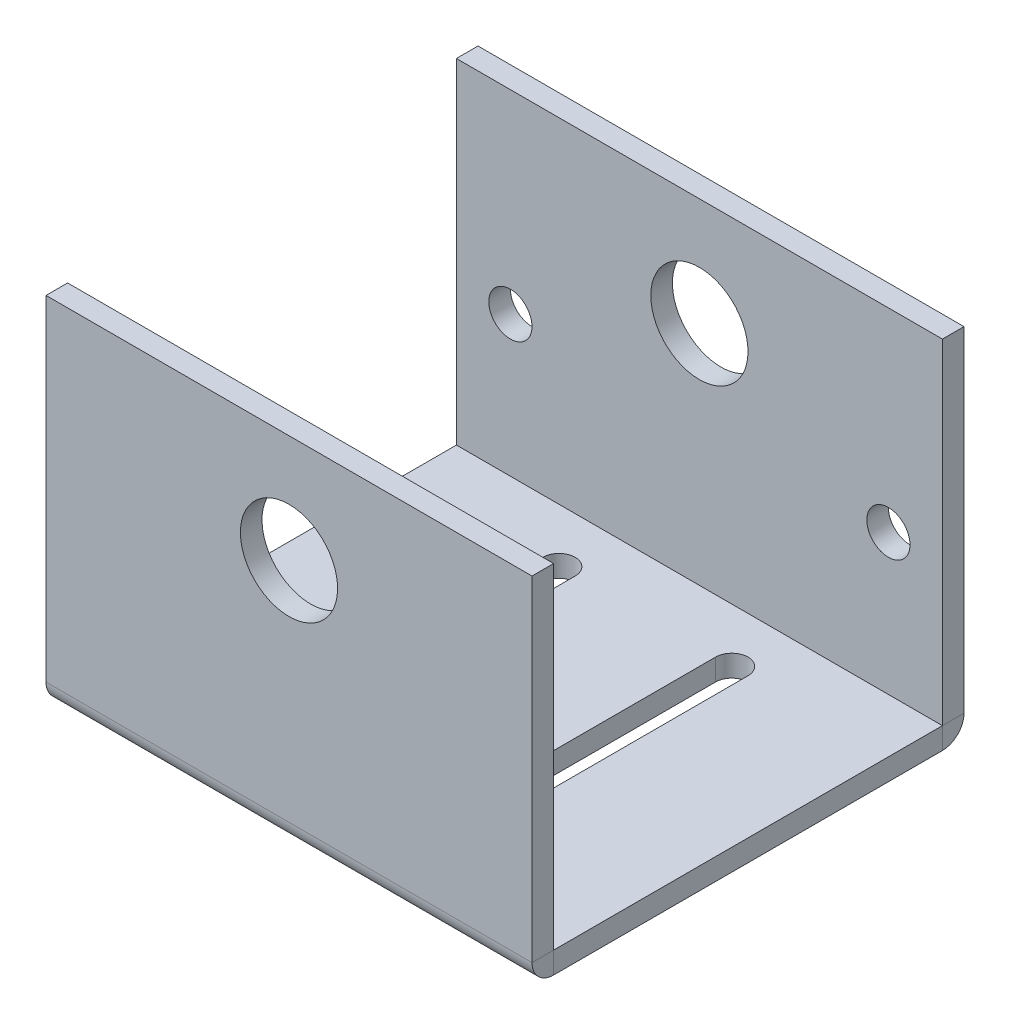
ISO-10303-21;
HEADER;
FILE_DESCRIPTION(('STEP AP214'),'2;1');
FILE_NAME('part.step','',(''),(''),'','','');
FILE_SCHEMA(('AUTOMOTIVE_DESIGN { 1 0 10303 214 1 1 1 1 }'));
ENDSEC;
DATA;
#1=APPLICATION_CONTEXT('core data for automotive mechanical design processes');
#2=APPLICATION_PROTOCOL_DEFINITION('international standard','automotive_design',2000,#1);
#3=PRODUCT_CONTEXT('',#1,'mechanical');
#4=PRODUCT('Part','Part','',(#3));
#5=PRODUCT_RELATED_PRODUCT_CATEGORY('part','',(#4));
#6=PRODUCT_DEFINITION_FORMATION('','',#4);
#7=PRODUCT_DEFINITION_CONTEXT('part definition',#1,'design');
#8=PRODUCT_DEFINITION('design','',#6,#7);
#9=PRODUCT_DEFINITION_SHAPE('','',#8);
#10=(LENGTH_UNIT() NAMED_UNIT(*) SI_UNIT(.MILLI.,.METRE.));
#11=(NAMED_UNIT(*) PLANE_ANGLE_UNIT() SI_UNIT($,.RADIAN.));
#12=(NAMED_UNIT(*) SI_UNIT($,.STERADIAN.) SOLID_ANGLE_UNIT());
#13=UNCERTAINTY_MEASURE_WITH_UNIT(LENGTH_MEASURE(1.E-05),#10,'distance_accuracy_value','');
#14=(GEOMETRIC_REPRESENTATION_CONTEXT(3) GLOBAL_UNCERTAINTY_ASSIGNED_CONTEXT((#13)) GLOBAL_UNIT_ASSIGNED_CONTEXT((#10,
#11,#12)) REPRESENTATION_CONTEXT('',''));
#15=CARTESIAN_POINT('',(0.,0.,0.));
#16=DIRECTION('',(0.,0.,1.));
#17=DIRECTION('',(1.,0.,0.));
#18=AXIS2_PLACEMENT_3D('',#15,#16,#17);
#19=CARTESIAN_POINT('',(0.,-2.,0.));
#20=DIRECTION('',(0.,1.,0.));
#21=DIRECTION('',(0.,0.,1.));
#22=AXIS2_PLACEMENT_3D('',#19,#20,#21);
#23=PLANE('',#22);
#24=DIRECTION('',(-1.,0.,0.));
#25=VECTOR('',#24,1.);
#26=CARTESIAN_POINT('',(0.,-2.,18.));
#27=LINE('',#26,#25);
#28=CARTESIAN_POINT('',(-22.5,-2.00000000000001,18.));
#29=VERTEX_POINT('',#28);
#30=CARTESIAN_POINT('',(22.5,-1.99999999999999,18.));
#31=VERTEX_POINT('',#30);
#32=EDGE_CURVE('E299',#29,#31,#27,.F.);
#33=ORIENTED_EDGE('',*,*,#32,.F.);
#34=DIRECTION('',(0.,0.,1.));
#35=VECTOR('',#34,1.);
#36=CARTESIAN_POINT('',(-22.5,-2.00000000000001,-20.));
#37=LINE('',#36,#35);
#38=CARTESIAN_POINT('',(-22.5,-2.00000000000001,-18.));
#39=VERTEX_POINT('',#38);
#40=EDGE_CURVE('E13',#39,#29,#37,.T.);
#41=ORIENTED_EDGE('',*,*,#40,.F.);
#42=DIRECTION('',(-1.,0.,0.));
#43=VECTOR('',#42,1.);
#44=CARTESIAN_POINT('',(0.,-2.,-18.));
#45=LINE('',#44,#43);
#46=CARTESIAN_POINT('',(22.5,-2.,-18.));
#47=VERTEX_POINT('',#46);
#48=EDGE_CURVE('E342',#47,#39,#45,.T.);
#49=ORIENTED_EDGE('',*,*,#48,.F.);
#50=DIRECTION('',(0.,0.,-1.));
#51=VECTOR('',#50,1.);
#52=CARTESIAN_POINT('',(22.5,-1.99999999999999,-20.));
#53=LINE('',#52,#51);
#54=EDGE_CURVE('E85',#31,#47,#53,.T.);
#55=ORIENTED_EDGE('',*,*,#54,.F.);
#56=EDGE_LOOP('',(#33,#41,#49,#55));
#57=FACE_BOUND('',#56,.T.);
#58=DIRECTION('',(0.,0.,-1.));
#59=VECTOR('',#58,1.);
#60=CARTESIAN_POINT('',(-9.49999999999999,-2.,13.));
#61=LINE('',#60,#59);
#62=CARTESIAN_POINT('',(-9.49999999999999,-2.,13.));
#63=VERTEX_POINT('',#62);
#64=CARTESIAN_POINT('',(-9.49999999999999,-2.,-13.));
#65=VERTEX_POINT('',#64);
#66=EDGE_CURVE('E236',#63,#65,#61,.T.);
#67=ORIENTED_EDGE('',*,*,#66,.F.);
#68=CARTESIAN_POINT('',(-7.99999999999999,-2.,13.));
#69=DIRECTION('',(0.,1.,0.));
#70=DIRECTION('',(0.,0.,1.));
#71=AXIS2_PLACEMENT_3D('',#68,#69,#70);
#72=CIRCLE('',#71,1.5);
#73=CARTESIAN_POINT('',(-6.49999999999999,-2.,13.));
#74=VERTEX_POINT('',#73);
#75=EDGE_CURVE('E239',#74,#63,#72,.F.);
#76=ORIENTED_EDGE('',*,*,#75,.F.);
#77=DIRECTION('',(0.,0.,1.));
#78=VECTOR('',#77,1.);
#79=CARTESIAN_POINT('',(-6.49999999999999,-2.,13.));
#80=LINE('',#79,#78);
#81=CARTESIAN_POINT('',(-6.49999999999999,-2.,-13.));
#82=VERTEX_POINT('',#81);
#83=EDGE_CURVE('E256',#82,#74,#80,.T.);
#84=ORIENTED_EDGE('',*,*,#83,.F.);
#85=CARTESIAN_POINT('',(-7.99999999999999,-2.,-13.));
#86=DIRECTION('',(0.,1.,0.));
#87=DIRECTION('',(0.,0.,1.));
#88=AXIS2_PLACEMENT_3D('',#85,#86,#87);
#89=CIRCLE('',#88,1.5);
#90=EDGE_CURVE('E208',#65,#82,#89,.F.);
#91=ORIENTED_EDGE('',*,*,#90,.F.);
#92=EDGE_LOOP('',(#67,#76,#84,#91));
#93=FACE_BOUND('',#92,.T.);
#94=CARTESIAN_POINT('',(7.99999999999999,-2.,13.));
#95=DIRECTION('',(0.,1.,0.));
#96=DIRECTION('',(0.,0.,1.));
#97=AXIS2_PLACEMENT_3D('',#94,#95,#96);
#98=CIRCLE('',#97,1.5);
#99=CARTESIAN_POINT('',(6.49999999999999,-2.,13.));
#100=VERTEX_POINT('',#99);
#101=CARTESIAN_POINT('',(9.49999999999999,-2.,13.));
#102=VERTEX_POINT('',#101);
#103=EDGE_CURVE('E212',#100,#102,#98,.T.);
#104=ORIENTED_EDGE('',*,*,#103,.T.);
#105=DIRECTION('',(0.,0.,-1.));
#106=VECTOR('',#105,1.);
#107=CARTESIAN_POINT('',(9.49999999999999,-2.,13.));
#108=LINE('',#107,#106);
#109=CARTESIAN_POINT('',(9.49999999999999,-2.,-13.));
#110=VERTEX_POINT('',#109);
#111=EDGE_CURVE('E201',#102,#110,#108,.T.);
#112=ORIENTED_EDGE('',*,*,#111,.T.);
#113=CARTESIAN_POINT('',(7.99999999999999,-2.,-13.));
#114=DIRECTION('',(0.,1.,0.));
#115=DIRECTION('',(0.,0.,1.));
#116=AXIS2_PLACEMENT_3D('',#113,#114,#115);
#117=CIRCLE('',#116,1.5);
#118=CARTESIAN_POINT('',(6.49999999999999,-2.,-13.));
#119=VERTEX_POINT('',#118);
#120=EDGE_CURVE('E221',#110,#119,#117,.T.);
#121=ORIENTED_EDGE('',*,*,#120,.T.);
#122=DIRECTION('',(0.,0.,1.));
#123=VECTOR('',#122,1.);
#124=CARTESIAN_POINT('',(6.49999999999999,-2.,13.));
#125=LINE('',#124,#123);
#126=EDGE_CURVE('E217',#119,#100,#125,.T.);
#127=ORIENTED_EDGE('',*,*,#126,.T.);
#128=EDGE_LOOP('',(#104,#112,#121,#127));
#129=FACE_BOUND('',#128,.T.);
#130=ADVANCED_FACE('F76',(#57,#93,#129),#23,.F.);
#131=CARTESIAN_POINT('',(0.,0.,0.));
#132=DIRECTION('',(0.,1.,0.));
#133=DIRECTION('',(0.,0.,1.));
#134=AXIS2_PLACEMENT_3D('',#131,#132,#133);
#135=PLANE('',#134);
#136=CARTESIAN_POINT('',(-7.99999999999999,0.,13.));
#137=DIRECTION('',(0.,1.,0.));
#138=DIRECTION('',(0.,0.,1.));
#139=AXIS2_PLACEMENT_3D('',#136,#137,#138);
#140=CIRCLE('',#139,1.5);
#141=CARTESIAN_POINT('',(-9.49999999999999,0.,13.));
#142=VERTEX_POINT('',#141);
#143=CARTESIAN_POINT('',(-6.49999999999999,0.,13.));
#144=VERTEX_POINT('',#143);
#145=EDGE_CURVE('E242',#142,#144,#140,.T.);
#146=ORIENTED_EDGE('',*,*,#145,.F.);
#147=DIRECTION('',(0.,0.,1.));
#148=VECTOR('',#147,1.);
#149=CARTESIAN_POINT('',(-9.49999999999999,0.,13.));
#150=LINE('',#149,#148);
#151=CARTESIAN_POINT('',(-9.49999999999999,0.,-13.));
#152=VERTEX_POINT('',#151);
#153=EDGE_CURVE('E250',#152,#142,#150,.T.);
#154=ORIENTED_EDGE('',*,*,#153,.F.);
#155=CARTESIAN_POINT('',(-7.99999999999999,0.,-13.));
#156=DIRECTION('',(0.,1.,0.));
#157=DIRECTION('',(0.,0.,1.));
#158=AXIS2_PLACEMENT_3D('',#155,#156,#157);
#159=CIRCLE('',#158,1.5);
#160=CARTESIAN_POINT('',(-6.5,0.,-13.));
#161=VERTEX_POINT('',#160);
#162=EDGE_CURVE('E247',#161,#152,#159,.T.);
#163=ORIENTED_EDGE('',*,*,#162,.F.);
#164=DIRECTION('',(0.,0.,-1.));
#165=VECTOR('',#164,1.);
#166=CARTESIAN_POINT('',(-6.49999999999999,0.,13.));
#167=LINE('',#166,#165);
#168=EDGE_CURVE('E244',#144,#161,#167,.T.);
#169=ORIENTED_EDGE('',*,*,#168,.F.);
#170=EDGE_LOOP('',(#146,#154,#163,#169));
#171=FACE_BOUND('',#170,.T.);
#172=DIRECTION('',(0.,0.,1.));
#173=VECTOR('',#172,1.);
#174=CARTESIAN_POINT('',(-22.5,0.,-20.));
#175=LINE('',#174,#173);
#176=CARTESIAN_POINT('',(-22.5,0.,-18.));
#177=VERTEX_POINT('',#176);
#178=CARTESIAN_POINT('',(-22.5,0.,18.));
#179=VERTEX_POINT('',#178);
#180=EDGE_CURVE('E354',#177,#179,#175,.T.);
#181=ORIENTED_EDGE('',*,*,#180,.T.);
#182=DIRECTION('',(1.,0.,0.));
#183=VECTOR('',#182,1.);
#184=CARTESIAN_POINT('',(-22.5,0.,18.));
#185=LINE('',#184,#183);
#186=CARTESIAN_POINT('',(22.5,0.,18.));
#187=VERTEX_POINT('',#186);
#188=EDGE_CURVE('E265',#179,#187,#185,.T.);
#189=ORIENTED_EDGE('',*,*,#188,.T.);
#190=DIRECTION('',(0.,0.,-1.));
#191=VECTOR('',#190,1.);
#192=CARTESIAN_POINT('',(22.5,0.,-20.));
#193=LINE('',#192,#191);
#194=CARTESIAN_POINT('',(22.5,0.,-18.));
#195=VERTEX_POINT('',#194);
#196=EDGE_CURVE('E352',#187,#195,#193,.T.);
#197=ORIENTED_EDGE('',*,*,#196,.T.);
#198=DIRECTION('',(1.,0.,0.));
#199=VECTOR('',#198,1.);
#200=CARTESIAN_POINT('',(22.5,0.,-18.));
#201=LINE('',#200,#199);
#202=EDGE_CURVE('E308',#195,#177,#201,.F.);
#203=ORIENTED_EDGE('',*,*,#202,.T.);
#204=EDGE_LOOP('',(#181,#189,#197,#203));
#205=FACE_BOUND('',#204,.T.);
#206=DIRECTION('',(0.,0.,1.));
#207=VECTOR('',#206,1.);
#208=CARTESIAN_POINT('',(9.49999999999999,0.,13.));
#209=LINE('',#208,#207);
#210=CARTESIAN_POINT('',(9.49999999999999,0.,-13.));
#211=VERTEX_POINT('',#210);
#212=CARTESIAN_POINT('',(9.49999999999999,0.,13.));
#213=VERTEX_POINT('',#212);
#214=EDGE_CURVE('E219',#211,#213,#209,.T.);
#215=ORIENTED_EDGE('',*,*,#214,.T.);
#216=CARTESIAN_POINT('',(7.99999999999999,0.,13.));
#217=DIRECTION('',(0.,-1.,0.));
#218=DIRECTION('',(0.,0.,1.));
#219=AXIS2_PLACEMENT_3D('',#216,#217,#218);
#220=CIRCLE('',#219,1.5);
#221=CARTESIAN_POINT('',(6.49999999999999,0.,13.));
#222=VERTEX_POINT('',#221);
#223=EDGE_CURVE('E101',#213,#222,#220,.T.);
#224=ORIENTED_EDGE('',*,*,#223,.T.);
#225=DIRECTION('',(0.,0.,-1.));
#226=VECTOR('',#225,1.);
#227=CARTESIAN_POINT('',(6.49999999999999,0.,13.));
#228=LINE('',#227,#226);
#229=CARTESIAN_POINT('',(6.49999999999999,0.,-13.));
#230=VERTEX_POINT('',#229);
#231=EDGE_CURVE('E214',#222,#230,#228,.T.);
#232=ORIENTED_EDGE('',*,*,#231,.T.);
#233=CARTESIAN_POINT('',(7.99999999999999,0.,-13.));
#234=DIRECTION('',(0.,-1.,0.));
#235=DIRECTION('',(0.,0.,1.));
#236=AXIS2_PLACEMENT_3D('',#233,#234,#235);
#237=CIRCLE('',#236,1.5);
#238=EDGE_CURVE('E226',#230,#211,#237,.T.);
#239=ORIENTED_EDGE('',*,*,#238,.T.);
#240=EDGE_LOOP('',(#215,#224,#232,#239));
#241=FACE_BOUND('',#240,.T.);
#242=ADVANCED_FACE('F359',(#171,#205,#241),#135,.T.);
#243=CARTESIAN_POINT('',(22.5,-1.99999999999999,-20.));
#244=DIRECTION('',(1.,0.,0.));
#245=DIRECTION('',(0.,0.,-1.));
#246=AXIS2_PLACEMENT_3D('',#243,#244,#245);
#247=PLANE('',#246);
#248=ORIENTED_EDGE('',*,*,#196,.F.);
#249=DIRECTION('',(0.,1.,0.));
#250=VECTOR('',#249,1.);
#251=CARTESIAN_POINT('',(22.5,-2.,18.));
#252=LINE('',#251,#250);
#253=EDGE_CURVE('E269',#31,#187,#252,.T.);
#254=ORIENTED_EDGE('',*,*,#253,.F.);
#255=ORIENTED_EDGE('',*,*,#54,.T.);
#256=DIRECTION('',(0.,1.,0.));
#257=VECTOR('',#256,1.);
#258=CARTESIAN_POINT('',(22.5,-2.,-18.));
#259=LINE('',#258,#257);
#260=EDGE_CURVE('E345',#47,#195,#259,.T.);
#261=ORIENTED_EDGE('',*,*,#260,.T.);
#262=EDGE_LOOP('',(#248,#254,#255,#261));
#263=FACE_BOUND('',#262,.T.);
#264=ADVANCED_FACE('F78',(#263),#247,.T.);
#265=CARTESIAN_POINT('',(-22.5,-2.00000000000001,-20.));
#266=DIRECTION('',(-1.,0.,0.));
#267=DIRECTION('',(0.,0.,1.));
#268=AXIS2_PLACEMENT_3D('',#265,#266,#267);
#269=PLANE('',#268);
#270=DIRECTION('',(0.,1.,0.));
#271=VECTOR('',#270,1.);
#272=CARTESIAN_POINT('',(-22.5,-2.00000000000001,18.));
#273=LINE('',#272,#271);
#274=EDGE_CURVE('E302',#29,#179,#273,.T.);
#275=ORIENTED_EDGE('',*,*,#274,.T.);
#276=ORIENTED_EDGE('',*,*,#180,.F.);
#277=DIRECTION('',(0.,1.,0.));
#278=VECTOR('',#277,1.);
#279=CARTESIAN_POINT('',(-22.5,-2.,-18.));
#280=LINE('',#279,#278);
#281=EDGE_CURVE('E312',#39,#177,#280,.T.);
#282=ORIENTED_EDGE('',*,*,#281,.F.);
#283=ORIENTED_EDGE('',*,*,#40,.T.);
#284=EDGE_LOOP('',(#275,#276,#282,#283));
#285=FACE_BOUND('',#284,.T.);
#286=ADVANCED_FACE('F414',(#285),#269,.T.);
#287=CARTESIAN_POINT('',(-22.5,-2.,-18.));
#288=DIRECTION('',(-1.,0.,0.));
#289=DIRECTION('',(0.,-1.,0.));
#290=AXIS2_PLACEMENT_3D('',#287,#288,#289);
#291=PLANE('',#290);
#292=CARTESIAN_POINT('',(-22.5,0.,-18.));
#293=DIRECTION('',(1.,0.,0.));
#294=DIRECTION('',(0.,1.,0.));
#295=AXIS2_PLACEMENT_3D('',#292,#293,#294);
#296=CIRCLE('',#295,2.);
#297=CARTESIAN_POINT('',(-22.5,0.,-20.));
#298=VERTEX_POINT('',#297);
#299=EDGE_CURVE('E350',#39,#298,#296,.T.);
#300=ORIENTED_EDGE('',*,*,#299,.F.);
#301=ORIENTED_EDGE('',*,*,#281,.T.);
#302=DIRECTION('',(0.,0.,1.));
#303=VECTOR('',#302,1.);
#304=CARTESIAN_POINT('',(-22.5,0.,-20.));
#305=LINE('',#304,#303);
#306=EDGE_CURVE('E309',#298,#177,#305,.T.);
#307=ORIENTED_EDGE('',*,*,#306,.F.);
#308=EDGE_LOOP('',(#300,#301,#307));
#309=FACE_BOUND('',#308,.T.);
#310=ADVANCED_FACE('F412',(#309),#291,.T.);
#311=CARTESIAN_POINT('',(22.5,0.,-18.));
#312=DIRECTION('',(1.,0.,0.));
#313=DIRECTION('',(0.,1.,0.));
#314=AXIS2_PLACEMENT_3D('',#311,#312,#313);
#315=CYLINDRICAL_SURFACE('',#314,2.);
#316=CARTESIAN_POINT('',(22.5,0.,-18.));
#317=DIRECTION('',(1.,0.,0.));
#318=DIRECTION('',(0.,1.,0.));
#319=AXIS2_PLACEMENT_3D('',#316,#317,#318);
#320=CIRCLE('',#319,2.);
#321=CARTESIAN_POINT('',(22.5,0.,-20.));
#322=VERTEX_POINT('',#321);
#323=EDGE_CURVE('E348',#47,#322,#320,.T.);
#324=ORIENTED_EDGE('',*,*,#323,.F.);
#325=ORIENTED_EDGE('',*,*,#48,.T.);
#326=ORIENTED_EDGE('',*,*,#299,.T.);
#327=DIRECTION('',(-1.,0.,0.));
#328=VECTOR('',#327,1.);
#329=CARTESIAN_POINT('',(0.,0.,-20.));
#330=LINE('',#329,#328);
#331=EDGE_CURVE('E329',#322,#298,#330,.T.);
#332=ORIENTED_EDGE('',*,*,#331,.F.);
#333=EDGE_LOOP('',(#324,#325,#326,#332));
#334=FACE_BOUND('',#333,.T.);
#335=ADVANCED_FACE('F447',(#334),#315,.T.);
#336=CARTESIAN_POINT('',(22.5,-2.,-18.));
#337=DIRECTION('',(-1.,0.,0.));
#338=DIRECTION('',(0.,-1.,0.));
#339=AXIS2_PLACEMENT_3D('',#336,#337,#338);
#340=PLANE('',#339);
#341=ORIENTED_EDGE('',*,*,#260,.F.);
#342=ORIENTED_EDGE('',*,*,#323,.T.);
#343=DIRECTION('',(0.,0.,1.));
#344=VECTOR('',#343,1.);
#345=CARTESIAN_POINT('',(22.5,0.,-20.));
#346=LINE('',#345,#344);
#347=EDGE_CURVE('E319',#322,#195,#346,.T.);
#348=ORIENTED_EDGE('',*,*,#347,.T.);
#349=EDGE_LOOP('',(#341,#342,#348));
#350=FACE_BOUND('',#349,.T.);
#351=ADVANCED_FACE('F395',(#350),#340,.F.);
#352=CARTESIAN_POINT('',(-22.5,31.,-20.0000000000001));
#353=DIRECTION('',(1.,0.,0.));
#354=DIRECTION('',(0.,1.,0.));
#355=AXIS2_PLACEMENT_3D('',#352,#353,#354);
#356=PLANE('',#355);
#357=DIRECTION('',(0.,-1.,0.));
#358=VECTOR('',#357,1.);
#359=CARTESIAN_POINT('',(-22.5,31.,-18.0000000000001));
#360=LINE('',#359,#358);
#361=CARTESIAN_POINT('',(-22.5,31.,-18.0000000000001));
#362=VERTEX_POINT('',#361);
#363=EDGE_CURVE('E337',#177,#362,#360,.F.);
#364=ORIENTED_EDGE('',*,*,#363,.T.);
#365=DIRECTION('',(0.,0.,1.));
#366=VECTOR('',#365,1.);
#367=CARTESIAN_POINT('',(-22.5,31.,-20.0000000000001));
#368=LINE('',#367,#366);
#369=CARTESIAN_POINT('',(-22.5,31.,-20.0000000000001));
#370=VERTEX_POINT('',#369);
#371=EDGE_CURVE('E313',#370,#362,#368,.T.);
#372=ORIENTED_EDGE('',*,*,#371,.F.);
#373=DIRECTION('',(0.,1.,0.));
#374=VECTOR('',#373,1.);
#375=CARTESIAN_POINT('',(-22.5,0.,-20.));
#376=LINE('',#375,#374);
#377=EDGE_CURVE('E327',#298,#370,#376,.T.);
#378=ORIENTED_EDGE('',*,*,#377,.F.);
#379=ORIENTED_EDGE('',*,*,#306,.T.);
#380=EDGE_LOOP('',(#364,#372,#378,#379));
#381=FACE_BOUND('',#380,.T.);
#382=ADVANCED_FACE('F409',(#381),#356,.F.);
#383=CARTESIAN_POINT('',(22.5,31.,-20.0000000000001));
#384=DIRECTION('',(0.,-1.,0.));
#385=DIRECTION('',(0.,0.,-1.));
#386=AXIS2_PLACEMENT_3D('',#383,#384,#385);
#387=PLANE('',#386);
#388=DIRECTION('',(-1.,0.,0.));
#389=VECTOR('',#388,1.);
#390=CARTESIAN_POINT('',(22.5,31.,-18.0000000000001));
#391=LINE('',#390,#389);
#392=CARTESIAN_POINT('',(22.5,31.,-18.0000000000001));
#393=VERTEX_POINT('',#392);
#394=EDGE_CURVE('E335',#362,#393,#391,.F.);
#395=ORIENTED_EDGE('',*,*,#394,.T.);
#396=DIRECTION('',(0.,0.,1.));
#397=VECTOR('',#396,1.);
#398=CARTESIAN_POINT('',(22.5,31.,-20.0000000000001));
#399=LINE('',#398,#397);
#400=CARTESIAN_POINT('',(22.5,31.,-20.0000000000001));
#401=VERTEX_POINT('',#400);
#402=EDGE_CURVE('E316',#401,#393,#399,.T.);
#403=ORIENTED_EDGE('',*,*,#402,.F.);
#404=DIRECTION('',(1.,0.,0.));
#405=VECTOR('',#404,1.);
#406=CARTESIAN_POINT('',(0.,31.,-20.0000000000001));
#407=LINE('',#406,#405);
#408=EDGE_CURVE('E325',#370,#401,#407,.T.);
#409=ORIENTED_EDGE('',*,*,#408,.F.);
#410=ORIENTED_EDGE('',*,*,#371,.T.);
#411=EDGE_LOOP('',(#395,#403,#409,#410));
#412=FACE_BOUND('',#411,.T.);
#413=ADVANCED_FACE('F691',(#412),#387,.F.);
#414=CARTESIAN_POINT('',(22.5,0.,-20.));
#415=DIRECTION('',(-1.,0.,0.));
#416=DIRECTION('',(0.,0.,1.));
#417=AXIS2_PLACEMENT_3D('',#414,#415,#416);
#418=PLANE('',#417);
#419=DIRECTION('',(0.,1.,0.));
#420=VECTOR('',#419,1.);
#421=CARTESIAN_POINT('',(22.5,0.,-18.));
#422=LINE('',#421,#420);
#423=EDGE_CURVE('E332',#393,#195,#422,.F.);
#424=ORIENTED_EDGE('',*,*,#423,.T.);
#425=ORIENTED_EDGE('',*,*,#347,.F.);
#426=DIRECTION('',(0.,-1.,0.));
#427=VECTOR('',#426,1.);
#428=CARTESIAN_POINT('',(22.5,0.,-20.));
#429=LINE('',#428,#427);
#430=EDGE_CURVE('E322',#401,#322,#429,.T.);
#431=ORIENTED_EDGE('',*,*,#430,.F.);
#432=ORIENTED_EDGE('',*,*,#402,.T.);
#433=EDGE_LOOP('',(#424,#425,#431,#432));
#434=FACE_BOUND('',#433,.T.);
#435=ADVANCED_FACE('F400',(#434),#418,.F.);
#436=CARTESIAN_POINT('',(0.,0.,-20.));
#437=DIRECTION('',(0.,0.,1.));
#438=DIRECTION('',(0.,-1.,0.));
#439=AXIS2_PLACEMENT_3D('',#436,#437,#438);
#440=PLANE('',#439);
#441=CARTESIAN_POINT('',(17.5,13.,-20.));
#442=DIRECTION('',(0.,0.,-1.));
#443=DIRECTION('',(0.,1.,0.));
#444=AXIS2_PLACEMENT_3D('',#441,#442,#443);
#445=CIRCLE('',#444,2.);
#446=CARTESIAN_POINT('',(17.5,15.,-20.0000000000001));
#447=VERTEX_POINT('',#446);
#448=EDGE_CURVE('E775',#447,#447,#445,.T.);
#449=ORIENTED_EDGE('',*,*,#448,.F.);
#450=EDGE_LOOP('',(#449));
#451=FACE_BOUND('',#450,.T.);
#452=CARTESIAN_POINT('',(-17.5,13.,-20.));
#453=DIRECTION('',(0.,0.,-1.));
#454=DIRECTION('',(0.,1.,0.));
#455=AXIS2_PLACEMENT_3D('',#452,#453,#454);
#456=CIRCLE('',#455,2.);
#457=CARTESIAN_POINT('',(-17.5,15.,-20.));
#458=VERTEX_POINT('',#457);
#459=EDGE_CURVE('E779',#458,#458,#456,.T.);
#460=ORIENTED_EDGE('',*,*,#459,.F.);
#461=EDGE_LOOP('',(#460));
#462=FACE_BOUND('',#461,.T.);
#463=CARTESIAN_POINT('',(0.,21.,-20.0000000000001));
#464=DIRECTION('',(0.,0.,-1.));
#465=DIRECTION('',(0.,1.,0.));
#466=AXIS2_PLACEMENT_3D('',#463,#464,#465);
#467=CIRCLE('',#466,4.5);
#468=CARTESIAN_POINT('',(0.,25.5,-20.0000000000001));
#469=VERTEX_POINT('',#468);
#470=EDGE_CURVE('E782',#469,#469,#467,.T.);
#471=ORIENTED_EDGE('',*,*,#470,.F.);
#472=EDGE_LOOP('',(#471));
#473=FACE_BOUND('',#472,.T.);
#474=ORIENTED_EDGE('',*,*,#331,.T.);
#475=ORIENTED_EDGE('',*,*,#377,.T.);
#476=ORIENTED_EDGE('',*,*,#408,.T.);
#477=ORIENTED_EDGE('',*,*,#430,.T.);
#478=EDGE_LOOP('',(#474,#475,#476,#477));
#479=FACE_BOUND('',#478,.T.);
#480=ADVANCED_FACE('F670',(#451,#462,#473,#479),#440,.F.);
#481=CARTESIAN_POINT('',(0.,0.,-18.));
#482=DIRECTION('',(0.,0.,1.));
#483=DIRECTION('',(0.,-1.,0.));
#484=AXIS2_PLACEMENT_3D('',#481,#482,#483);
#485=PLANE('',#484);
#486=CARTESIAN_POINT('',(17.5,13.,-18.0000000000001));
#487=DIRECTION('',(0.,0.,1.));
#488=DIRECTION('',(0.,-1.,0.));
#489=AXIS2_PLACEMENT_3D('',#486,#487,#488);
#490=CIRCLE('',#489,2.);
#491=CARTESIAN_POINT('',(17.5,11.,-18.));
#492=VERTEX_POINT('',#491);
#493=EDGE_CURVE('E788',#492,#492,#490,.F.);
#494=ORIENTED_EDGE('',*,*,#493,.T.);
#495=EDGE_LOOP('',(#494));
#496=FACE_BOUND('',#495,.T.);
#497=CARTESIAN_POINT('',(-17.5,13.,-18.));
#498=DIRECTION('',(0.,0.,1.));
#499=DIRECTION('',(0.,-1.,0.));
#500=AXIS2_PLACEMENT_3D('',#497,#498,#499);
#501=CIRCLE('',#500,2.);
#502=CARTESIAN_POINT('',(-17.5,11.,-18.));
#503=VERTEX_POINT('',#502);
#504=EDGE_CURVE('E803',#503,#503,#501,.F.);
#505=ORIENTED_EDGE('',*,*,#504,.T.);
#506=EDGE_LOOP('',(#505));
#507=FACE_BOUND('',#506,.T.);
#508=CARTESIAN_POINT('',(0.,21.,-18.0000000000001));
#509=DIRECTION('',(0.,0.,1.));
#510=DIRECTION('',(0.,-1.,0.));
#511=AXIS2_PLACEMENT_3D('',#508,#509,#510);
#512=CIRCLE('',#511,4.5);
#513=CARTESIAN_POINT('',(0.,16.5,-18.0000000000001));
#514=VERTEX_POINT('',#513);
#515=EDGE_CURVE('E792',#514,#514,#512,.T.);
#516=ORIENTED_EDGE('',*,*,#515,.F.);
#517=EDGE_LOOP('',(#516));
#518=FACE_BOUND('',#517,.T.);
#519=ORIENTED_EDGE('',*,*,#202,.F.);
#520=ORIENTED_EDGE('',*,*,#423,.F.);
#521=ORIENTED_EDGE('',*,*,#394,.F.);
#522=ORIENTED_EDGE('',*,*,#363,.F.);
#523=EDGE_LOOP('',(#519,#520,#521,#522));
#524=FACE_BOUND('',#523,.T.);
#525=ADVANCED_FACE('F404',(#496,#507,#518,#524),#485,.T.);
#526=CARTESIAN_POINT('',(22.5,-2.,18.));
#527=DIRECTION('',(1.,0.,0.));
#528=DIRECTION('',(0.,0.,-1.));
#529=AXIS2_PLACEMENT_3D('',#526,#527,#528);
#530=PLANE('',#529);
#531=CARTESIAN_POINT('',(22.5,0.,18.));
#532=DIRECTION('',(-1.,0.,0.));
#533=DIRECTION('',(0.,0.,1.));
#534=AXIS2_PLACEMENT_3D('',#531,#532,#533);
#535=CIRCLE('',#534,2.);
#536=CARTESIAN_POINT('',(22.5,0.,20.));
#537=VERTEX_POINT('',#536);
#538=EDGE_CURVE('E306',#31,#537,#535,.T.);
#539=ORIENTED_EDGE('',*,*,#538,.F.);
#540=ORIENTED_EDGE('',*,*,#253,.T.);
#541=DIRECTION('',(0.,0.,-1.));
#542=VECTOR('',#541,1.);
#543=CARTESIAN_POINT('',(22.5,0.,20.));
#544=LINE('',#543,#542);
#545=EDGE_CURVE('E266',#537,#187,#544,.T.);
#546=ORIENTED_EDGE('',*,*,#545,.F.);
#547=EDGE_LOOP('',(#539,#540,#546));
#548=FACE_BOUND('',#547,.T.);
#549=ADVANCED_FACE('F387',(#548),#530,.T.);
#550=CARTESIAN_POINT('',(-22.5,0.,18.));
#551=DIRECTION('',(-1.,0.,0.));
#552=DIRECTION('',(0.,0.,1.));
#553=AXIS2_PLACEMENT_3D('',#550,#551,#552);
#554=CYLINDRICAL_SURFACE('',#553,2.);
#555=CARTESIAN_POINT('',(-22.5,0.,18.));
#556=DIRECTION('',(-1.,0.,0.));
#557=DIRECTION('',(0.,0.,1.));
#558=AXIS2_PLACEMENT_3D('',#555,#556,#557);
#559=CIRCLE('',#558,2.);
#560=CARTESIAN_POINT('',(-22.5,0.,20.));
#561=VERTEX_POINT('',#560);
#562=EDGE_CURVE('E304',#29,#561,#559,.T.);
#563=ORIENTED_EDGE('',*,*,#562,.F.);
#564=ORIENTED_EDGE('',*,*,#32,.T.);
#565=ORIENTED_EDGE('',*,*,#538,.T.);
#566=DIRECTION('',(-1.,0.,0.));
#567=VECTOR('',#566,1.);
#568=CARTESIAN_POINT('',(0.,0.,20.));
#569=LINE('',#568,#567);
#570=EDGE_CURVE('E286',#561,#537,#569,.F.);
#571=ORIENTED_EDGE('',*,*,#570,.F.);
#572=EDGE_LOOP('',(#563,#564,#565,#571));
#573=FACE_BOUND('',#572,.T.);
#574=ADVANCED_FACE('F419',(#573),#554,.T.);
#575=CARTESIAN_POINT('',(-22.5,-2.00000000000001,18.));
#576=DIRECTION('',(1.,0.,0.));
#577=DIRECTION('',(0.,0.,-1.));
#578=AXIS2_PLACEMENT_3D('',#575,#576,#577);
#579=PLANE('',#578);
#580=ORIENTED_EDGE('',*,*,#274,.F.);
#581=ORIENTED_EDGE('',*,*,#562,.T.);
#582=DIRECTION('',(0.,0.,-1.));
#583=VECTOR('',#582,1.);
#584=CARTESIAN_POINT('',(-22.5,0.,20.));
#585=LINE('',#584,#583);
#586=EDGE_CURVE('E276',#561,#179,#585,.T.);
#587=ORIENTED_EDGE('',*,*,#586,.T.);
#588=EDGE_LOOP('',(#580,#581,#587));
#589=FACE_BOUND('',#588,.T.);
#590=ADVANCED_FACE('F369',(#589),#579,.F.);
#591=CARTESIAN_POINT('',(22.5,0.,20.));
#592=DIRECTION('',(-1.,0.,0.));
#593=DIRECTION('',(0.,0.,1.));
#594=AXIS2_PLACEMENT_3D('',#591,#592,#593);
#595=PLANE('',#594);
#596=DIRECTION('',(0.,1.,0.));
#597=VECTOR('',#596,1.);
#598=CARTESIAN_POINT('',(22.5,0.,18.));
#599=LINE('',#598,#597);
#600=CARTESIAN_POINT('',(22.5,31.,18.));
#601=VERTEX_POINT('',#600);
#602=EDGE_CURVE('E294',#187,#601,#599,.T.);
#603=ORIENTED_EDGE('',*,*,#602,.T.);
#604=DIRECTION('',(0.,0.,-1.));
#605=VECTOR('',#604,1.);
#606=CARTESIAN_POINT('',(22.5,31.,20.));
#607=LINE('',#606,#605);
#608=CARTESIAN_POINT('',(22.5,31.,20.));
#609=VERTEX_POINT('',#608);
#610=EDGE_CURVE('E270',#609,#601,#607,.T.);
#611=ORIENTED_EDGE('',*,*,#610,.F.);
#612=DIRECTION('',(0.,-1.,0.));
#613=VECTOR('',#612,1.);
#614=CARTESIAN_POINT('',(22.5,0.,20.));
#615=LINE('',#614,#613);
#616=EDGE_CURVE('E284',#537,#609,#615,.F.);
#617=ORIENTED_EDGE('',*,*,#616,.F.);
#618=ORIENTED_EDGE('',*,*,#545,.T.);
#619=EDGE_LOOP('',(#603,#611,#617,#618));
#620=FACE_BOUND('',#619,.T.);
#621=ADVANCED_FACE('F384',(#620),#595,.F.);
#622=CARTESIAN_POINT('',(22.5,31.,20.));
#623=DIRECTION('',(0.,-1.,0.));
#624=DIRECTION('',(0.,0.,-1.));
#625=AXIS2_PLACEMENT_3D('',#622,#623,#624);
#626=PLANE('',#625);
#627=DIRECTION('',(-1.,0.,0.));
#628=VECTOR('',#627,1.);
#629=CARTESIAN_POINT('',(22.5,31.,18.));
#630=LINE('',#629,#628);
#631=CARTESIAN_POINT('',(-22.5,31.,18.));
#632=VERTEX_POINT('',#631);
#633=EDGE_CURVE('E292',#601,#632,#630,.T.);
#634=ORIENTED_EDGE('',*,*,#633,.T.);
#635=DIRECTION('',(0.,0.,-1.));
#636=VECTOR('',#635,1.);
#637=CARTESIAN_POINT('',(-22.5,31.,20.));
#638=LINE('',#637,#636);
#639=CARTESIAN_POINT('',(-22.5,31.,20.));
#640=VERTEX_POINT('',#639);
#641=EDGE_CURVE('E273',#640,#632,#638,.T.);
#642=ORIENTED_EDGE('',*,*,#641,.F.);
#643=DIRECTION('',(1.,0.,0.));
#644=VECTOR('',#643,1.);
#645=CARTESIAN_POINT('',(0.,31.,20.));
#646=LINE('',#645,#644);
#647=EDGE_CURVE('E282',#609,#640,#646,.F.);
#648=ORIENTED_EDGE('',*,*,#647,.F.);
#649=ORIENTED_EDGE('',*,*,#610,.T.);
#650=EDGE_LOOP('',(#634,#642,#648,#649));
#651=FACE_BOUND('',#650,.T.);
#652=ADVANCED_FACE('F424',(#651),#626,.F.);
#653=CARTESIAN_POINT('',(-22.5,31.,20.));
#654=DIRECTION('',(1.,0.,0.));
#655=DIRECTION('',(0.,1.,0.));
#656=AXIS2_PLACEMENT_3D('',#653,#654,#655);
#657=PLANE('',#656);
#658=DIRECTION('',(0.,-1.,0.));
#659=VECTOR('',#658,1.);
#660=CARTESIAN_POINT('',(-22.5,31.,18.));
#661=LINE('',#660,#659);
#662=EDGE_CURVE('E289',#632,#179,#661,.T.);
#663=ORIENTED_EDGE('',*,*,#662,.T.);
#664=ORIENTED_EDGE('',*,*,#586,.F.);
#665=DIRECTION('',(0.,1.,0.));
#666=VECTOR('',#665,1.);
#667=CARTESIAN_POINT('',(-22.5,0.,20.));
#668=LINE('',#667,#666);
#669=EDGE_CURVE('E279',#640,#561,#668,.F.);
#670=ORIENTED_EDGE('',*,*,#669,.F.);
#671=ORIENTED_EDGE('',*,*,#641,.T.);
#672=EDGE_LOOP('',(#663,#664,#670,#671));
#673=FACE_BOUND('',#672,.T.);
#674=ADVANCED_FACE('F375',(#673),#657,.F.);
#675=CARTESIAN_POINT('',(0.,0.,20.));
#676=DIRECTION('',(0.,0.,1.));
#677=DIRECTION('',(1.,0.,0.));
#678=AXIS2_PLACEMENT_3D('',#675,#676,#677);
#679=PLANE('',#678);
#680=CARTESIAN_POINT('',(0.,21.0000000000001,20.));
#681=DIRECTION('',(0.,0.,-1.));
#682=DIRECTION('',(0.,1.,0.));
#683=AXIS2_PLACEMENT_3D('',#680,#681,#682);
#684=CIRCLE('',#683,4.5);
#685=CARTESIAN_POINT('',(0.,25.5000000000001,20.));
#686=VERTEX_POINT('',#685);
#687=EDGE_CURVE('E784',#686,#686,#684,.T.);
#688=ORIENTED_EDGE('',*,*,#687,.T.);
#689=EDGE_LOOP('',(#688));
#690=FACE_BOUND('',#689,.T.);
#691=ORIENTED_EDGE('',*,*,#570,.T.);
#692=ORIENTED_EDGE('',*,*,#616,.T.);
#693=ORIENTED_EDGE('',*,*,#647,.T.);
#694=ORIENTED_EDGE('',*,*,#669,.T.);
#695=EDGE_LOOP('',(#691,#692,#693,#694));
#696=FACE_BOUND('',#695,.T.);
#697=ADVANCED_FACE('F421',(#690,#696),#679,.T.);
#698=CARTESIAN_POINT('',(0.,0.,18.));
#699=DIRECTION('',(0.,0.,1.));
#700=DIRECTION('',(1.,0.,0.));
#701=AXIS2_PLACEMENT_3D('',#698,#699,#700);
#702=PLANE('',#701);
#703=CARTESIAN_POINT('',(0.,21.0000000000001,18.));
#704=DIRECTION('',(0.,0.,1.));
#705=DIRECTION('',(1.,0.,0.));
#706=AXIS2_PLACEMENT_3D('',#703,#704,#705);
#707=CIRCLE('',#706,4.5);
#708=CARTESIAN_POINT('',(4.5,21.0000000000001,18.));
#709=VERTEX_POINT('',#708);
#710=EDGE_CURVE('E80',#709,#709,#707,.T.);
#711=ORIENTED_EDGE('',*,*,#710,.T.);
#712=EDGE_LOOP('',(#711));
#713=FACE_BOUND('',#712,.T.);
#714=ORIENTED_EDGE('',*,*,#188,.F.);
#715=ORIENTED_EDGE('',*,*,#662,.F.);
#716=ORIENTED_EDGE('',*,*,#633,.F.);
#717=ORIENTED_EDGE('',*,*,#602,.F.);
#718=EDGE_LOOP('',(#714,#715,#716,#717));
#719=FACE_BOUND('',#718,.T.);
#720=ADVANCED_FACE('F379',(#713,#719),#702,.F.);
#721=CARTESIAN_POINT('',(-7.99999999999999,-2.001,13.));
#722=DIRECTION('',(0.,1.,0.));
#723=DIRECTION('',(0.,0.,1.));
#724=AXIS2_PLACEMENT_3D('',#721,#722,#723);
#725=CYLINDRICAL_SURFACE('',#724,1.5);
#726=ORIENTED_EDGE('',*,*,#75,.T.);
#727=DIRECTION('',(0.,1.,0.));
#728=VECTOR('',#727,1.);
#729=CARTESIAN_POINT('',(-9.49999999999999,-2.001,13.));
#730=LINE('',#729,#728);
#731=EDGE_CURVE('E254',#63,#142,#730,.T.);
#732=ORIENTED_EDGE('',*,*,#731,.T.);
#733=ORIENTED_EDGE('',*,*,#145,.T.);
#734=DIRECTION('',(0.,1.,0.));
#735=VECTOR('',#734,1.);
#736=CARTESIAN_POINT('',(-6.49999999999999,-2.001,13.));
#737=LINE('',#736,#735);
#738=EDGE_CURVE('E253',#74,#144,#737,.T.);
#739=ORIENTED_EDGE('',*,*,#738,.F.);
#740=EDGE_LOOP('',(#726,#732,#733,#739));
#741=FACE_BOUND('',#740,.T.);
#742=ADVANCED_FACE('F583',(#741),#725,.F.);
#743=CARTESIAN_POINT('',(-9.49999999999999,-2.001,13.));
#744=DIRECTION('',(-1.,0.,0.));
#745=DIRECTION('',(0.,0.,1.));
#746=AXIS2_PLACEMENT_3D('',#743,#744,#745);
#747=PLANE('',#746);
#748=ORIENTED_EDGE('',*,*,#66,.T.);
#749=DIRECTION('',(0.,1.,0.));
#750=VECTOR('',#749,1.);
#751=CARTESIAN_POINT('',(-9.49999999999999,-2.001,-13.));
#752=LINE('',#751,#750);
#753=EDGE_CURVE('E257',#65,#152,#752,.T.);
#754=ORIENTED_EDGE('',*,*,#753,.T.);
#755=ORIENTED_EDGE('',*,*,#153,.T.);
#756=ORIENTED_EDGE('',*,*,#731,.F.);
#757=EDGE_LOOP('',(#748,#754,#755,#756));
#758=FACE_BOUND('',#757,.T.);
#759=ADVANCED_FACE('F572',(#758),#747,.F.);
#760=CARTESIAN_POINT('',(-7.99999999999999,-2.001,-13.));
#761=DIRECTION('',(0.,1.,0.));
#762=DIRECTION('',(0.,0.,1.));
#763=AXIS2_PLACEMENT_3D('',#760,#761,#762);
#764=CYLINDRICAL_SURFACE('',#763,1.5);
#765=ORIENTED_EDGE('',*,*,#90,.T.);
#766=DIRECTION('',(0.,1.,0.));
#767=VECTOR('',#766,1.);
#768=CARTESIAN_POINT('',(-6.5,-2.001,-13.));
#769=LINE('',#768,#767);
#770=EDGE_CURVE('E259',#82,#161,#769,.T.);
#771=ORIENTED_EDGE('',*,*,#770,.T.);
#772=ORIENTED_EDGE('',*,*,#162,.T.);
#773=ORIENTED_EDGE('',*,*,#753,.F.);
#774=EDGE_LOOP('',(#765,#771,#772,#773));
#775=FACE_BOUND('',#774,.T.);
#776=ADVANCED_FACE('F562',(#775),#764,.F.);
#777=CARTESIAN_POINT('',(-6.49999999999999,-2.001,13.));
#778=DIRECTION('',(1.,0.,0.));
#779=DIRECTION('',(0.,0.,-1.));
#780=AXIS2_PLACEMENT_3D('',#777,#778,#779);
#781=PLANE('',#780);
#782=ORIENTED_EDGE('',*,*,#83,.T.);
#783=ORIENTED_EDGE('',*,*,#738,.T.);
#784=ORIENTED_EDGE('',*,*,#168,.T.);
#785=ORIENTED_EDGE('',*,*,#770,.F.);
#786=EDGE_LOOP('',(#782,#783,#784,#785));
#787=FACE_BOUND('',#786,.T.);
#788=ADVANCED_FACE('F471',(#787),#781,.F.);
#789=CARTESIAN_POINT('',(7.99999999999999,-2.001,13.));
#790=DIRECTION('',(0.,1.,0.));
#791=DIRECTION('',(0.,0.,1.));
#792=AXIS2_PLACEMENT_3D('',#789,#790,#791);
#793=CYLINDRICAL_SURFACE('',#792,1.5);
#794=DIRECTION('',(0.,1.,0.));
#795=VECTOR('',#794,1.);
#796=CARTESIAN_POINT('',(6.49999999999999,-2.001,13.));
#797=LINE('',#796,#795);
#798=EDGE_CURVE('E209',#100,#222,#797,.T.);
#799=ORIENTED_EDGE('',*,*,#798,.T.);
#800=ORIENTED_EDGE('',*,*,#223,.F.);
#801=DIRECTION('',(0.,1.,0.));
#802=VECTOR('',#801,1.);
#803=CARTESIAN_POINT('',(9.49999999999999,-2.001,13.));
#804=LINE('',#803,#802);
#805=EDGE_CURVE('E203',#102,#213,#804,.T.);
#806=ORIENTED_EDGE('',*,*,#805,.F.);
#807=ORIENTED_EDGE('',*,*,#103,.F.);
#808=EDGE_LOOP('',(#799,#800,#806,#807));
#809=FACE_BOUND('',#808,.T.);
#810=ADVANCED_FACE('F211',(#809),#793,.F.);
#811=CARTESIAN_POINT('',(6.49999999999999,-2.001,13.));
#812=DIRECTION('',(1.,0.,0.));
#813=DIRECTION('',(0.,0.,-1.));
#814=AXIS2_PLACEMENT_3D('',#811,#812,#813);
#815=PLANE('',#814);
#816=DIRECTION('',(0.,1.,0.));
#817=VECTOR('',#816,1.);
#818=CARTESIAN_POINT('',(6.49999999999999,-2.001,-13.));
#819=LINE('',#818,#817);
#820=EDGE_CURVE('E232',#119,#230,#819,.T.);
#821=ORIENTED_EDGE('',*,*,#820,.T.);
#822=ORIENTED_EDGE('',*,*,#231,.F.);
#823=ORIENTED_EDGE('',*,*,#798,.F.);
#824=ORIENTED_EDGE('',*,*,#126,.F.);
#825=EDGE_LOOP('',(#821,#822,#823,#824));
#826=FACE_BOUND('',#825,.T.);
#827=ADVANCED_FACE('F470',(#826),#815,.T.);
#828=CARTESIAN_POINT('',(7.99999999999999,-2.001,-13.));
#829=DIRECTION('',(0.,1.,0.));
#830=DIRECTION('',(0.,0.,1.));
#831=AXIS2_PLACEMENT_3D('',#828,#829,#830);
#832=CYLINDRICAL_SURFACE('',#831,1.5);
#833=DIRECTION('',(0.,1.,0.));
#834=VECTOR('',#833,1.);
#835=CARTESIAN_POINT('',(9.49999999999999,-2.001,-13.));
#836=LINE('',#835,#834);
#837=EDGE_CURVE('E93',#110,#211,#836,.T.);
#838=ORIENTED_EDGE('',*,*,#837,.T.);
#839=ORIENTED_EDGE('',*,*,#238,.F.);
#840=ORIENTED_EDGE('',*,*,#820,.F.);
#841=ORIENTED_EDGE('',*,*,#120,.F.);
#842=EDGE_LOOP('',(#838,#839,#840,#841));
#843=FACE_BOUND('',#842,.T.);
#844=ADVANCED_FACE('F480',(#843),#832,.F.);
#845=CARTESIAN_POINT('',(9.49999999999999,-2.001,13.));
#846=DIRECTION('',(-1.,0.,0.));
#847=DIRECTION('',(0.,0.,1.));
#848=AXIS2_PLACEMENT_3D('',#845,#846,#847);
#849=PLANE('',#848);
#850=ORIENTED_EDGE('',*,*,#805,.T.);
#851=ORIENTED_EDGE('',*,*,#214,.F.);
#852=ORIENTED_EDGE('',*,*,#837,.F.);
#853=ORIENTED_EDGE('',*,*,#111,.F.);
#854=EDGE_LOOP('',(#850,#851,#852,#853));
#855=FACE_BOUND('',#854,.T.);
#856=ADVANCED_FACE('F202',(#855),#849,.T.);
#857=CARTESIAN_POINT('',(0.,21.0000000000001,20.));
#858=DIRECTION('',(0.,0.,-1.));
#859=DIRECTION('',(0.,1.,0.));
#860=AXIS2_PLACEMENT_3D('',#857,#858,#859);
#861=CYLINDRICAL_SURFACE('',#860,4.5);
#862=ORIENTED_EDGE('',*,*,#687,.F.);
#863=EDGE_LOOP('',(#862));
#864=FACE_BOUND('',#863,.T.);
#865=ORIENTED_EDGE('',*,*,#710,.F.);
#866=EDGE_LOOP('',(#865));
#867=FACE_BOUND('',#866,.T.);
#868=ADVANCED_FACE('F499',(#864,#867),#861,.F.);
#869=ORIENTED_EDGE('',*,*,#515,.T.);
#870=EDGE_LOOP('',(#869));
#871=FACE_BOUND('',#870,.T.);
#872=ORIENTED_EDGE('',*,*,#470,.T.);
#873=EDGE_LOOP('',(#872));
#874=FACE_BOUND('',#873,.T.);
#875=ADVANCED_FACE('F508',(#871,#874),#861,.F.);
#876=CARTESIAN_POINT('',(-17.5,13.0000000000001,20.0010000000001));
#877=DIRECTION('',(0.,0.,-1.));
#878=DIRECTION('',(0.,1.,0.));
#879=AXIS2_PLACEMENT_3D('',#876,#877,#878);
#880=CYLINDRICAL_SURFACE('',#879,2.);
#881=ORIENTED_EDGE('',*,*,#504,.F.);
#882=EDGE_LOOP('',(#881));
#883=FACE_BOUND('',#882,.T.);
#884=ORIENTED_EDGE('',*,*,#459,.T.);
#885=EDGE_LOOP('',(#884));
#886=FACE_BOUND('',#885,.T.);
#887=ADVANCED_FACE('F518',(#883,#886),#880,.F.);
#888=CARTESIAN_POINT('',(17.5,13.0000000000001,20.0010000000001));
#889=DIRECTION('',(0.,0.,-1.));
#890=DIRECTION('',(0.,1.,0.));
#891=AXIS2_PLACEMENT_3D('',#888,#889,#890);
#892=CYLINDRICAL_SURFACE('',#891,2.);
#893=ORIENTED_EDGE('',*,*,#493,.F.);
#894=EDGE_LOOP('',(#893));
#895=FACE_BOUND('',#894,.T.);
#896=ORIENTED_EDGE('',*,*,#448,.T.);
#897=EDGE_LOOP('',(#896));
#898=FACE_BOUND('',#897,.T.);
#899=ADVANCED_FACE('F527',(#895,#898),#892,.F.);
#900=CLOSED_SHELL('',(#130,#242,#264,#286,#310,#335,#351,#382,#413,#435,#480,#525,#549,#574,
#590,#621,#652,#674,#697,#720,#742,#759,#776,#788,#810,#827,#844,#856,#868,#875,#887,#899));
#901=MANIFOLD_SOLID_BREP('B2',#900);
#902=ADVANCED_BREP_SHAPE_REPRESENTATION('',(#18,#901),#14);
#903=SHAPE_DEFINITION_REPRESENTATION(#9,#902);
ENDSEC;
END-ISO-10303-21;
